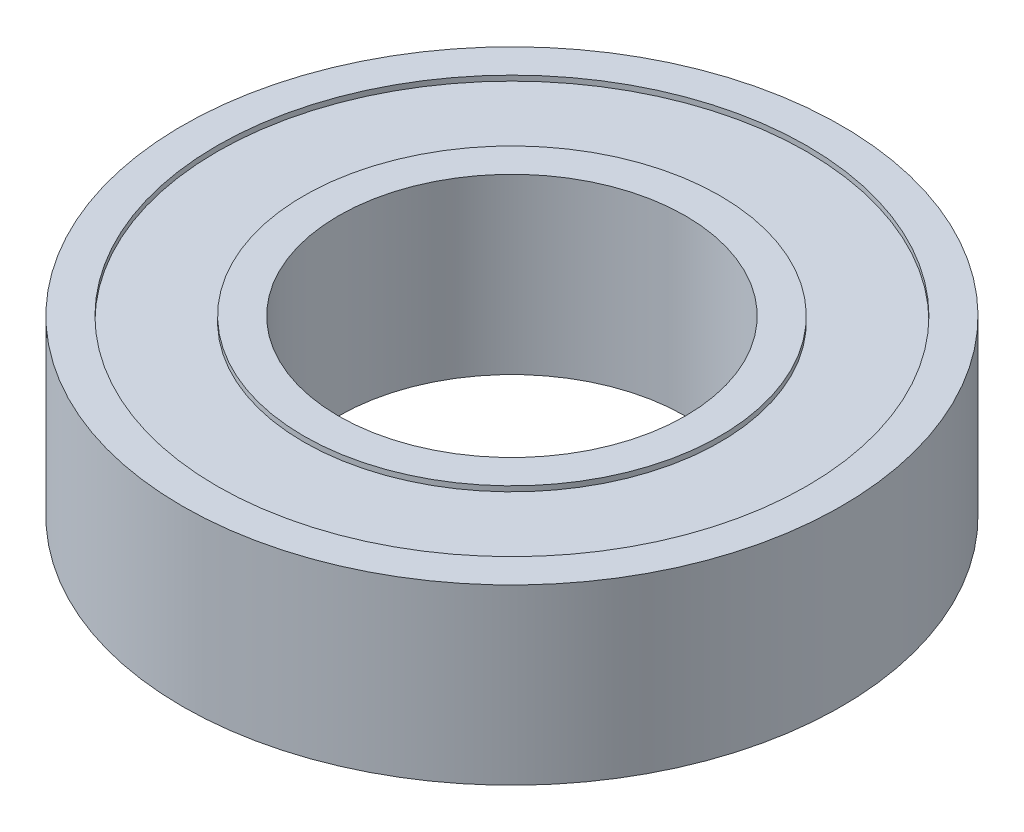
ISO-10303-21;
HEADER;
FILE_DESCRIPTION(('STEP AP214'),'2;1');
FILE_NAME('part.step','',(''),(''),'','','');
FILE_SCHEMA(('AUTOMOTIVE_DESIGN { 1 0 10303 214 1 1 1 1 }'));
ENDSEC;
DATA;
#1=APPLICATION_CONTEXT('core data for automotive mechanical design processes');
#2=APPLICATION_PROTOCOL_DEFINITION('international standard','automotive_design',2000,#1);
#3=PRODUCT_CONTEXT('',#1,'mechanical');
#4=PRODUCT('Part','Part','',(#3));
#5=PRODUCT_RELATED_PRODUCT_CATEGORY('part','',(#4));
#6=PRODUCT_DEFINITION_FORMATION('','',#4);
#7=PRODUCT_DEFINITION_CONTEXT('part definition',#1,'design');
#8=PRODUCT_DEFINITION('design','',#6,#7);
#9=PRODUCT_DEFINITION_SHAPE('','',#8);
#10=(LENGTH_UNIT() NAMED_UNIT(*) SI_UNIT(.MILLI.,.METRE.));
#11=(NAMED_UNIT(*) PLANE_ANGLE_UNIT() SI_UNIT($,.RADIAN.));
#12=(NAMED_UNIT(*) SI_UNIT($,.STERADIAN.) SOLID_ANGLE_UNIT());
#13=UNCERTAINTY_MEASURE_WITH_UNIT(LENGTH_MEASURE(1.E-05),#10,'distance_accuracy_value','');
#14=(GEOMETRIC_REPRESENTATION_CONTEXT(3) GLOBAL_UNCERTAINTY_ASSIGNED_CONTEXT((#13)) GLOBAL_UNIT_ASSIGNED_CONTEXT((#10,
#11,#12)) REPRESENTATION_CONTEXT('',''));
#15=CARTESIAN_POINT('',(0.,0.,0.));
#16=DIRECTION('',(0.,0.,1.));
#17=DIRECTION('',(1.,0.,0.));
#18=AXIS2_PLACEMENT_3D('',#15,#16,#17);
#19=CARTESIAN_POINT('',(0.,-2.5,0.));
#20=DIRECTION('',(0.,1.,0.));
#21=DIRECTION('',(0.,0.,1.));
#22=AXIS2_PLACEMENT_3D('',#19,#20,#21);
#23=PLANE('',#22);
#24=CARTESIAN_POINT('',(0.,-2.5,0.));
#25=DIRECTION('',(0.,1.,0.));
#26=DIRECTION('',(0.,0.,1.));
#27=AXIS2_PLACEMENT_3D('',#24,#25,#26);
#28=CIRCLE('',#27,5.);
#29=CARTESIAN_POINT('',(0.,-2.5,5.));
#30=VERTEX_POINT('',#29);
#31=EDGE_CURVE('E46',#30,#30,#28,.T.);
#32=ORIENTED_EDGE('',*,*,#31,.T.);
#33=EDGE_LOOP('',(#32));
#34=FACE_BOUND('',#33,.T.);
#35=CARTESIAN_POINT('',(0.,-2.5,0.));
#36=DIRECTION('',(0.,1.,0.));
#37=DIRECTION('',(0.,0.,1.));
#38=AXIS2_PLACEMENT_3D('',#35,#36,#37);
#39=CIRCLE('',#38,6.);
#40=CARTESIAN_POINT('',(0.,-2.5,6.));
#41=VERTEX_POINT('',#40);
#42=EDGE_CURVE('E70',#41,#41,#39,.T.);
#43=ORIENTED_EDGE('',*,*,#42,.F.);
#44=EDGE_LOOP('',(#43));
#45=FACE_BOUND('',#44,.T.);
#46=ADVANCED_FACE('F33',(#34,#45),#23,.F.);
#47=CARTESIAN_POINT('',(0.,2.5,0.));
#48=DIRECTION('',(0.,1.,0.));
#49=DIRECTION('',(0.,0.,1.));
#50=AXIS2_PLACEMENT_3D('',#47,#48,#49);
#51=PLANE('',#50);
#52=CARTESIAN_POINT('',(0.,2.5,0.));
#53=DIRECTION('',(0.,1.,0.));
#54=DIRECTION('',(0.,0.,1.));
#55=AXIS2_PLACEMENT_3D('',#52,#53,#54);
#56=CIRCLE('',#55,5.);
#57=CARTESIAN_POINT('',(0.,2.5,5.));
#58=VERTEX_POINT('',#57);
#59=EDGE_CURVE('E44',#58,#58,#56,.T.);
#60=ORIENTED_EDGE('',*,*,#59,.F.);
#61=EDGE_LOOP('',(#60));
#62=FACE_BOUND('',#61,.T.);
#63=CARTESIAN_POINT('',(0.,2.5,0.));
#64=DIRECTION('',(0.,1.,0.));
#65=DIRECTION('',(0.,0.,1.));
#66=AXIS2_PLACEMENT_3D('',#63,#64,#65);
#67=CIRCLE('',#66,6.);
#68=CARTESIAN_POINT('',(0.,2.5,6.));
#69=VERTEX_POINT('',#68);
#70=EDGE_CURVE('E58',#69,#69,#67,.T.);
#71=ORIENTED_EDGE('',*,*,#70,.T.);
#72=EDGE_LOOP('',(#71));
#73=FACE_BOUND('',#72,.T.);
#74=ADVANCED_FACE('F86',(#62,#73),#51,.T.);
#75=CARTESIAN_POINT('',(0.,2.5,0.));
#76=DIRECTION('',(0.,1.,0.));
#77=DIRECTION('',(0.,0.,1.));
#78=AXIS2_PLACEMENT_3D('',#75,#76,#77);
#79=CIRCLE('',#78,8.5);
#80=CARTESIAN_POINT('',(0.,2.5,8.5));
#81=VERTEX_POINT('',#80);
#82=EDGE_CURVE('E52',#81,#81,#79,.T.);
#83=ORIENTED_EDGE('',*,*,#82,.F.);
#84=EDGE_LOOP('',(#83));
#85=FACE_BOUND('',#84,.T.);
#86=CARTESIAN_POINT('',(0.,2.5,0.));
#87=DIRECTION('',(0.,1.,0.));
#88=DIRECTION('',(0.,0.,1.));
#89=AXIS2_PLACEMENT_3D('',#86,#87,#88);
#90=CIRCLE('',#89,9.5);
#91=CARTESIAN_POINT('',(0.,2.5,9.5));
#92=VERTEX_POINT('',#91);
#93=EDGE_CURVE('E10',#92,#92,#90,.T.);
#94=ORIENTED_EDGE('',*,*,#93,.T.);
#95=EDGE_LOOP('',(#94));
#96=FACE_BOUND('',#95,.T.);
#97=ADVANCED_FACE('F94',(#85,#96),#51,.T.);
#98=CARTESIAN_POINT('',(0.,-2.5,0.));
#99=DIRECTION('',(0.,1.,0.));
#100=DIRECTION('',(0.,0.,1.));
#101=AXIS2_PLACEMENT_3D('',#98,#99,#100);
#102=CIRCLE('',#101,8.5);
#103=CARTESIAN_POINT('',(0.,-2.5,8.5));
#104=VERTEX_POINT('',#103);
#105=EDGE_CURVE('E64',#104,#104,#102,.T.);
#106=ORIENTED_EDGE('',*,*,#105,.T.);
#107=EDGE_LOOP('',(#106));
#108=FACE_BOUND('',#107,.T.);
#109=CARTESIAN_POINT('',(0.,-2.5,0.));
#110=DIRECTION('',(0.,1.,0.));
#111=DIRECTION('',(0.,0.,1.));
#112=AXIS2_PLACEMENT_3D('',#109,#110,#111);
#113=CIRCLE('',#112,9.5);
#114=CARTESIAN_POINT('',(0.,-2.5,9.5));
#115=VERTEX_POINT('',#114);
#116=EDGE_CURVE('E37',#115,#115,#113,.T.);
#117=ORIENTED_EDGE('',*,*,#116,.F.);
#118=EDGE_LOOP('',(#117));
#119=FACE_BOUND('',#118,.T.);
#120=ADVANCED_FACE('F88',(#108,#119),#23,.F.);
#121=CARTESIAN_POINT('',(0.,2.5,0.));
#122=DIRECTION('',(0.,-1.,0.));
#123=DIRECTION('',(0.,0.,-1.));
#124=AXIS2_PLACEMENT_3D('',#121,#122,#123);
#125=CYLINDRICAL_SURFACE('',#124,9.5);
#126=ORIENTED_EDGE('',*,*,#93,.F.);
#127=EDGE_LOOP('',(#126));
#128=FACE_BOUND('',#127,.T.);
#129=ORIENTED_EDGE('',*,*,#116,.T.);
#130=EDGE_LOOP('',(#129));
#131=FACE_BOUND('',#130,.T.);
#132=ADVANCED_FACE('F35',(#128,#131),#125,.T.);
#133=CARTESIAN_POINT('',(0.,2.5,0.));
#134=DIRECTION('',(0.,-1.,0.));
#135=DIRECTION('',(0.,0.,-1.));
#136=AXIS2_PLACEMENT_3D('',#133,#134,#135);
#137=CYLINDRICAL_SURFACE('',#136,5.);
#138=ORIENTED_EDGE('',*,*,#59,.T.);
#139=EDGE_LOOP('',(#138));
#140=FACE_BOUND('',#139,.T.);
#141=ORIENTED_EDGE('',*,*,#31,.F.);
#142=EDGE_LOOP('',(#141));
#143=FACE_BOUND('',#142,.T.);
#144=ADVANCED_FACE('F102',(#140,#143),#137,.F.);
#145=CARTESIAN_POINT('',(0.,2.35,0.));
#146=DIRECTION('',(0.,1.,0.));
#147=DIRECTION('',(0.,0.,1.));
#148=AXIS2_PLACEMENT_3D('',#145,#146,#147);
#149=CYLINDRICAL_SURFACE('',#148,8.5);
#150=CARTESIAN_POINT('',(0.,2.35,0.));
#151=DIRECTION('',(0.,1.,0.));
#152=DIRECTION('',(0.,0.,1.));
#153=AXIS2_PLACEMENT_3D('',#150,#151,#152);
#154=CIRCLE('',#153,8.5);
#155=CARTESIAN_POINT('',(0.,2.35,8.5));
#156=VERTEX_POINT('',#155);
#157=EDGE_CURVE('E49',#156,#156,#154,.T.);
#158=ORIENTED_EDGE('',*,*,#157,.F.);
#159=EDGE_LOOP('',(#158));
#160=FACE_BOUND('',#159,.T.);
#161=ORIENTED_EDGE('',*,*,#82,.T.);
#162=EDGE_LOOP('',(#161));
#163=FACE_BOUND('',#162,.T.);
#164=ADVANCED_FACE('F127',(#160,#163),#149,.F.);
#165=CARTESIAN_POINT('',(0.,2.35,0.));
#166=DIRECTION('',(0.,1.,0.));
#167=DIRECTION('',(0.,0.,1.));
#168=AXIS2_PLACEMENT_3D('',#165,#166,#167);
#169=PLANE('',#168);
#170=CARTESIAN_POINT('',(0.,2.35,0.));
#171=DIRECTION('',(0.,1.,0.));
#172=DIRECTION('',(0.,0.,1.));
#173=AXIS2_PLACEMENT_3D('',#170,#171,#172);
#174=CIRCLE('',#173,6.);
#175=CARTESIAN_POINT('',(0.,2.35,6.));
#176=VERTEX_POINT('',#175);
#177=EDGE_CURVE('E55',#176,#176,#174,.T.);
#178=ORIENTED_EDGE('',*,*,#177,.F.);
#179=EDGE_LOOP('',(#178));
#180=FACE_BOUND('',#179,.T.);
#181=ORIENTED_EDGE('',*,*,#157,.T.);
#182=EDGE_LOOP('',(#181));
#183=FACE_BOUND('',#182,.T.);
#184=ADVANCED_FACE('F123',(#180,#183),#169,.T.);
#185=CARTESIAN_POINT('',(0.,2.35,0.));
#186=DIRECTION('',(0.,1.,0.));
#187=DIRECTION('',(0.,0.,1.));
#188=AXIS2_PLACEMENT_3D('',#185,#186,#187);
#189=CYLINDRICAL_SURFACE('',#188,6.);
#190=ORIENTED_EDGE('',*,*,#177,.T.);
#191=EDGE_LOOP('',(#190));
#192=FACE_BOUND('',#191,.T.);
#193=ORIENTED_EDGE('',*,*,#70,.F.);
#194=EDGE_LOOP('',(#193));
#195=FACE_BOUND('',#194,.T.);
#196=ADVANCED_FACE('F117',(#192,#195),#189,.T.);
#197=CARTESIAN_POINT('',(0.,-2.35,0.));
#198=DIRECTION('',(0.,-1.,0.));
#199=DIRECTION('',(0.,0.,1.));
#200=AXIS2_PLACEMENT_3D('',#197,#198,#199);
#201=PLANE('',#200);
#202=CARTESIAN_POINT('',(0.,-2.35,0.));
#203=DIRECTION('',(0.,1.,0.));
#204=DIRECTION('',(0.,0.,1.));
#205=AXIS2_PLACEMENT_3D('',#202,#203,#204);
#206=CIRCLE('',#205,8.5);
#207=CARTESIAN_POINT('',(0.,-2.35,8.5));
#208=VERTEX_POINT('',#207);
#209=EDGE_CURVE('E61',#208,#208,#206,.T.);
#210=ORIENTED_EDGE('',*,*,#209,.F.);
#211=EDGE_LOOP('',(#210));
#212=FACE_BOUND('',#211,.T.);
#213=CARTESIAN_POINT('',(0.,-2.35,0.));
#214=DIRECTION('',(0.,1.,0.));
#215=DIRECTION('',(0.,0.,1.));
#216=AXIS2_PLACEMENT_3D('',#213,#214,#215);
#217=CIRCLE('',#216,6.);
#218=CARTESIAN_POINT('',(0.,-2.35,6.));
#219=VERTEX_POINT('',#218);
#220=EDGE_CURVE('E67',#219,#219,#217,.T.);
#221=ORIENTED_EDGE('',*,*,#220,.T.);
#222=EDGE_LOOP('',(#221));
#223=FACE_BOUND('',#222,.T.);
#224=ADVANCED_FACE('F76',(#212,#223),#201,.T.);
#225=CARTESIAN_POINT('',(0.,-2.35,0.));
#226=DIRECTION('',(0.,-1.,0.));
#227=DIRECTION('',(0.,0.,-1.));
#228=AXIS2_PLACEMENT_3D('',#225,#226,#227);
#229=CYLINDRICAL_SURFACE('',#228,8.5);
#230=ORIENTED_EDGE('',*,*,#209,.T.);
#231=EDGE_LOOP('',(#230));
#232=FACE_BOUND('',#231,.T.);
#233=ORIENTED_EDGE('',*,*,#105,.F.);
#234=EDGE_LOOP('',(#233));
#235=FACE_BOUND('',#234,.T.);
#236=ADVANCED_FACE('F81',(#232,#235),#229,.F.);
#237=CARTESIAN_POINT('',(0.,-2.35,0.));
#238=DIRECTION('',(0.,-1.,0.));
#239=DIRECTION('',(0.,0.,-1.));
#240=AXIS2_PLACEMENT_3D('',#237,#238,#239);
#241=CYLINDRICAL_SURFACE('',#240,6.);
#242=ORIENTED_EDGE('',*,*,#220,.F.);
#243=EDGE_LOOP('',(#242));
#244=FACE_BOUND('',#243,.T.);
#245=ORIENTED_EDGE('',*,*,#42,.T.);
#246=EDGE_LOOP('',(#245));
#247=FACE_BOUND('',#246,.T.);
#248=ADVANCED_FACE('F78',(#244,#247),#241,.T.);
#249=CLOSED_SHELL('',(#46,#74,#97,#120,#132,#144,#164,#184,#196,#224,#236,#248));
#250=MANIFOLD_SOLID_BREP('B2',#249);
#251=ADVANCED_BREP_SHAPE_REPRESENTATION('',(#18,#250),#14);
#252=SHAPE_DEFINITION_REPRESENTATION(#9,#251);
ENDSEC;
END-ISO-10303-21;
